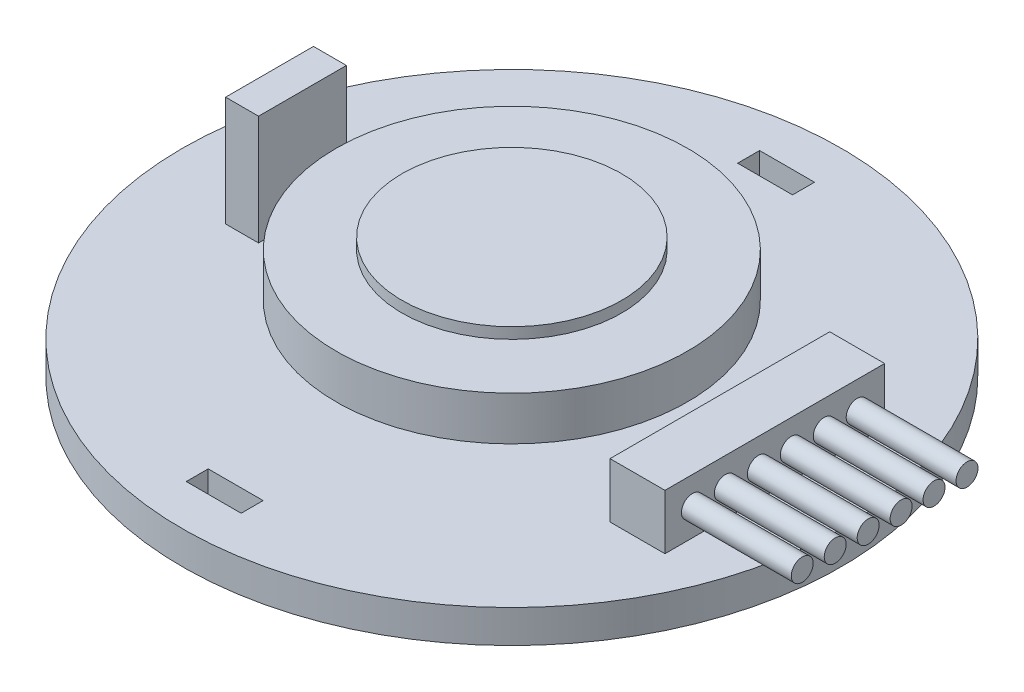
ISO-10303-21;
HEADER;
FILE_DESCRIPTION(('STEP AP214'),'2;1');
FILE_NAME('part.step','',(''),(''),'','','');
FILE_SCHEMA(('AUTOMOTIVE_DESIGN { 1 0 10303 214 1 1 1 1 }'));
ENDSEC;
DATA;
#1=APPLICATION_CONTEXT('core data for automotive mechanical design processes');
#2=APPLICATION_PROTOCOL_DEFINITION('international standard','automotive_design',2000,#1);
#3=PRODUCT_CONTEXT('',#1,'mechanical');
#4=PRODUCT('Part','Part','',(#3));
#5=PRODUCT_RELATED_PRODUCT_CATEGORY('part','',(#4));
#6=PRODUCT_DEFINITION_FORMATION('','',#4);
#7=PRODUCT_DEFINITION_CONTEXT('part definition',#1,'design');
#8=PRODUCT_DEFINITION('design','',#6,#7);
#9=PRODUCT_DEFINITION_SHAPE('','',#8);
#10=(LENGTH_UNIT() NAMED_UNIT(*) SI_UNIT(.MILLI.,.METRE.));
#11=(NAMED_UNIT(*) PLANE_ANGLE_UNIT() SI_UNIT($,.RADIAN.));
#12=(NAMED_UNIT(*) SI_UNIT($,.STERADIAN.) SOLID_ANGLE_UNIT());
#13=UNCERTAINTY_MEASURE_WITH_UNIT(LENGTH_MEASURE(1.E-05),#10,'distance_accuracy_value','');
#14=(GEOMETRIC_REPRESENTATION_CONTEXT(3) GLOBAL_UNCERTAINTY_ASSIGNED_CONTEXT((#13)) GLOBAL_UNIT_ASSIGNED_CONTEXT((#10,
#11,#12)) REPRESENTATION_CONTEXT('',''));
#15=CARTESIAN_POINT('',(0.,0.,0.));
#16=DIRECTION('',(0.,0.,1.));
#17=DIRECTION('',(1.,0.,0.));
#18=AXIS2_PLACEMENT_3D('',#15,#16,#17);
#19=CARTESIAN_POINT('',(15.0301297165824,1.07813382095376,0.));
#20=DIRECTION('',(0.,-1.,0.));
#21=DIRECTION('',(1.,0.,0.));
#22=AXIS2_PLACEMENT_3D('',#19,#20,#21);
#23=PLANE('',#22);
#24=CARTESIAN_POINT('',(0.0301297165823786,1.07813382095375,0.));
#25=DIRECTION('',(0.,1.,0.));
#26=DIRECTION('',(-1.,0.,0.));
#27=AXIS2_PLACEMENT_3D('',#24,#25,#26);
#28=CIRCLE('',#27,15.);
#29=CARTESIAN_POINT('',(-14.9698702834176,1.07813382095375,0.));
#30=VERTEX_POINT('',#29);
#31=EDGE_CURVE('E303',#30,#30,#28,.T.);
#32=ORIENTED_EDGE('',*,*,#31,.T.);
#33=EDGE_LOOP('',(#32));
#34=FACE_BOUND('',#33,.T.);
#35=CARTESIAN_POINT('',(0.0301297165823786,1.07813382095375,0.));
#36=DIRECTION('',(0.,1.,0.));
#37=DIRECTION('',(-1.,0.,0.));
#38=AXIS2_PLACEMENT_3D('',#35,#36,#37);
#39=CIRCLE('',#38,1.20000000000001);
#40=CARTESIAN_POINT('',(-1.16987028341763,1.07813382095375,0.));
#41=VERTEX_POINT('',#40);
#42=EDGE_CURVE('E300',#41,#41,#39,.T.);
#43=ORIENTED_EDGE('',*,*,#42,.F.);
#44=EDGE_LOOP('',(#43));
#45=FACE_BOUND('',#44,.T.);
#46=DIRECTION('',(1.,0.,0.));
#47=VECTOR('',#46,1.);
#48=CARTESIAN_POINT('',(-1.74201497399318,1.07813382095375,-12.05));
#49=LINE('',#48,#47);
#50=CARTESIAN_POINT('',(-1.74201497399318,1.07813382095376,-12.05));
#51=VERTEX_POINT('',#50);
#52=CARTESIAN_POINT('',(0.757985026006817,1.07813382095376,-12.05));
#53=VERTEX_POINT('',#52);
#54=EDGE_CURVE('E253',#51,#53,#49,.T.);
#55=ORIENTED_EDGE('',*,*,#54,.F.);
#56=DIRECTION('',(0.,0.,1.));
#57=VECTOR('',#56,1.);
#58=CARTESIAN_POINT('',(-1.74201497399318,1.07813382095375,-13.05));
#59=LINE('',#58,#57);
#60=CARTESIAN_POINT('',(-1.74201497399318,1.07813382095375,-13.05));
#61=VERTEX_POINT('',#60);
#62=EDGE_CURVE('E256',#61,#51,#59,.T.);
#63=ORIENTED_EDGE('',*,*,#62,.F.);
#64=DIRECTION('',(-1.,0.,0.));
#65=VECTOR('',#64,1.);
#66=CARTESIAN_POINT('',(-1.74201497399318,1.07813382095375,-13.05));
#67=LINE('',#66,#65);
#68=CARTESIAN_POINT('',(0.757985026006817,1.07813382095375,-13.05));
#69=VERTEX_POINT('',#68);
#70=EDGE_CURVE('E273',#69,#61,#67,.T.);
#71=ORIENTED_EDGE('',*,*,#70,.F.);
#72=DIRECTION('',(0.,0.,-1.));
#73=VECTOR('',#72,1.);
#74=CARTESIAN_POINT('',(0.757985026006817,1.07813382095375,-13.05));
#75=LINE('',#74,#73);
#76=EDGE_CURVE('E251',#53,#69,#75,.T.);
#77=ORIENTED_EDGE('',*,*,#76,.F.);
#78=EDGE_LOOP('',(#55,#63,#71,#77));
#79=FACE_BOUND('',#78,.T.);
#80=DIRECTION('',(1.,0.,0.));
#81=VECTOR('',#80,1.);
#82=CARTESIAN_POINT('',(-1.74201497399318,1.07813382095375,13.05));
#83=LINE('',#82,#81);
#84=CARTESIAN_POINT('',(-1.74201497399318,1.07813382095376,13.05));
#85=VERTEX_POINT('',#84);
#86=CARTESIAN_POINT('',(0.757985026006817,1.07813382095376,13.05));
#87=VERTEX_POINT('',#86);
#88=EDGE_CURVE('E222',#85,#87,#83,.T.);
#89=ORIENTED_EDGE('',*,*,#88,.F.);
#90=DIRECTION('',(0.,0.,1.));
#91=VECTOR('',#90,1.);
#92=CARTESIAN_POINT('',(-1.74201497399318,1.07813382095375,12.05));
#93=LINE('',#92,#91);
#94=CARTESIAN_POINT('',(-1.74201497399318,1.07813382095375,12.05));
#95=VERTEX_POINT('',#94);
#96=EDGE_CURVE('E225',#95,#85,#93,.T.);
#97=ORIENTED_EDGE('',*,*,#96,.F.);
#98=DIRECTION('',(-1.,0.,0.));
#99=VECTOR('',#98,1.);
#100=CARTESIAN_POINT('',(-1.74201497399318,1.07813382095375,12.05));
#101=LINE('',#100,#99);
#102=CARTESIAN_POINT('',(0.757985026006817,1.07813382095375,12.05));
#103=VERTEX_POINT('',#102);
#104=EDGE_CURVE('E242',#103,#95,#101,.T.);
#105=ORIENTED_EDGE('',*,*,#104,.F.);
#106=DIRECTION('',(0.,0.,-1.));
#107=VECTOR('',#106,1.);
#108=CARTESIAN_POINT('',(0.757985026006817,1.07813382095375,12.05));
#109=LINE('',#108,#107);
#110=EDGE_CURVE('E215',#87,#103,#109,.T.);
#111=ORIENTED_EDGE('',*,*,#110,.F.);
#112=EDGE_LOOP('',(#89,#97,#105,#111));
#113=FACE_BOUND('',#112,.T.);
#114=DIRECTION('',(1.,0.,0.));
#115=VECTOR('',#114,1.);
#116=CARTESIAN_POINT('',(-11.,1.07813382095375,2.));
#117=LINE('',#116,#115);
#118=CARTESIAN_POINT('',(-11.,1.07813382095375,2.));
#119=VERTEX_POINT('',#118);
#120=CARTESIAN_POINT('',(-9.5,1.07813382095375,2.));
#121=VERTEX_POINT('',#120);
#122=EDGE_CURVE('E201',#119,#121,#117,.T.);
#123=ORIENTED_EDGE('',*,*,#122,.F.);
#124=DIRECTION('',(0.,0.,-1.));
#125=VECTOR('',#124,1.);
#126=CARTESIAN_POINT('',(-11.,1.07813382095375,2.));
#127=LINE('',#126,#125);
#128=CARTESIAN_POINT('',(-11.,1.07813382095375,-2.));
#129=VERTEX_POINT('',#128);
#130=EDGE_CURVE('E188',#119,#129,#127,.T.);
#131=ORIENTED_EDGE('',*,*,#130,.T.);
#132=DIRECTION('',(1.,0.,0.));
#133=VECTOR('',#132,1.);
#134=CARTESIAN_POINT('',(-11.,1.07813382095375,-2.));
#135=LINE('',#134,#133);
#136=CARTESIAN_POINT('',(-9.5,1.07813382095375,-2.));
#137=VERTEX_POINT('',#136);
#138=EDGE_CURVE('E191',#129,#137,#135,.T.);
#139=ORIENTED_EDGE('',*,*,#138,.T.);
#140=DIRECTION('',(0.,0.,-1.));
#141=VECTOR('',#140,1.);
#142=CARTESIAN_POINT('',(-9.5,1.07813382095375,2.));
#143=LINE('',#142,#141);
#144=EDGE_CURVE('E71',#121,#137,#143,.T.);
#145=ORIENTED_EDGE('',*,*,#144,.F.);
#146=EDGE_LOOP('',(#123,#131,#139,#145));
#147=FACE_BOUND('',#146,.T.);
#148=DIRECTION('',(1.,0.,0.));
#149=VECTOR('',#148,1.);
#150=CARTESIAN_POINT('',(9.5,1.07813382095376,5.));
#151=LINE('',#150,#149);
#152=CARTESIAN_POINT('',(9.5,1.07813382095376,5.));
#153=VERTEX_POINT('',#152);
#154=CARTESIAN_POINT('',(12.,1.07813382095376,5.));
#155=VERTEX_POINT('',#154);
#156=EDGE_CURVE('E186',#153,#155,#151,.T.);
#157=ORIENTED_EDGE('',*,*,#156,.F.);
#158=DIRECTION('',(0.,0.,-1.));
#159=VECTOR('',#158,1.);
#160=CARTESIAN_POINT('',(9.5,1.07813382095376,5.));
#161=LINE('',#160,#159);
#162=CARTESIAN_POINT('',(9.5,1.07813382095376,-5.));
#163=VERTEX_POINT('',#162);
#164=EDGE_CURVE('E182',#153,#163,#161,.T.);
#165=ORIENTED_EDGE('',*,*,#164,.T.);
#166=DIRECTION('',(1.,0.,0.));
#167=VECTOR('',#166,1.);
#168=CARTESIAN_POINT('',(9.5,1.07813382095376,-5.));
#169=LINE('',#168,#167);
#170=CARTESIAN_POINT('',(12.,1.07813382095376,-5.));
#171=VERTEX_POINT('',#170);
#172=EDGE_CURVE('E63',#163,#171,#169,.T.);
#173=ORIENTED_EDGE('',*,*,#172,.T.);
#174=DIRECTION('',(0.,0.,-1.));
#175=VECTOR('',#174,1.);
#176=CARTESIAN_POINT('',(12.,1.07813382095376,5.));
#177=LINE('',#176,#175);
#178=EDGE_CURVE('E834',#155,#171,#177,.T.);
#179=ORIENTED_EDGE('',*,*,#178,.F.);
#180=EDGE_LOOP('',(#157,#165,#173,#179));
#181=FACE_BOUND('',#180,.T.);
#182=ADVANCED_FACE('F48',(#34,#45,#79,#113,#147,#181),#23,.F.);
#183=CARTESIAN_POINT('',(0.0301297165823793,-4.42186617904624,0.));
#184=DIRECTION('',(0.,1.,0.));
#185=DIRECTION('',(-1.,0.,0.));
#186=AXIS2_PLACEMENT_3D('',#183,#184,#185);
#187=PLANE('',#186);
#188=CARTESIAN_POINT('',(0.0301297165823793,-4.42186617904624,0.));
#189=DIRECTION('',(0.,1.,0.));
#190=DIRECTION('',(-1.,0.,0.));
#191=AXIS2_PLACEMENT_3D('',#188,#189,#190);
#192=CIRCLE('',#191,1.2);
#193=CARTESIAN_POINT('',(-1.16987028341762,-4.42186617904624,0.));
#194=VERTEX_POINT('',#193);
#195=EDGE_CURVE('E312',#194,#194,#192,.T.);
#196=ORIENTED_EDGE('',*,*,#195,.F.);
#197=EDGE_LOOP('',(#196));
#198=FACE_BOUND('',#197,.T.);
#199=ADVANCED_FACE('F50',(#198),#187,.F.);
#200=CARTESIAN_POINT('',(0.0301297165823781,5.07813382095375,0.));
#201=DIRECTION('',(0.,1.,0.));
#202=DIRECTION('',(-1.,0.,0.));
#203=AXIS2_PLACEMENT_3D('',#200,#201,#202);
#204=CYLINDRICAL_SURFACE('',#203,1.2);
#205=CARTESIAN_POINT('',(0.0301297165823788,-0.421866179046244,0.));
#206=DIRECTION('',(0.,1.,0.));
#207=DIRECTION('',(-1.,0.,0.));
#208=AXIS2_PLACEMENT_3D('',#205,#206,#207);
#209=CIRCLE('',#208,1.2);
#210=CARTESIAN_POINT('',(-1.16987028341762,-0.421866179046244,0.));
#211=VERTEX_POINT('',#210);
#212=EDGE_CURVE('E309',#211,#211,#209,.T.);
#213=ORIENTED_EDGE('',*,*,#212,.F.);
#214=EDGE_LOOP('',(#213));
#215=FACE_BOUND('',#214,.T.);
#216=ORIENTED_EDGE('',*,*,#195,.T.);
#217=EDGE_LOOP('',(#216));
#218=FACE_BOUND('',#217,.T.);
#219=ADVANCED_FACE('F365',(#215,#218),#204,.T.);
#220=CARTESIAN_POINT('',(1.23012971658238,-0.421866179046245,0.));
#221=DIRECTION('',(0.,1.,0.));
#222=DIRECTION('',(-1.,0.,0.));
#223=AXIS2_PLACEMENT_3D('',#220,#221,#222);
#224=PLANE('',#223);
#225=DIRECTION('',(1.,0.,0.));
#226=VECTOR('',#225,1.);
#227=CARTESIAN_POINT('',(-1.74201497399318,-0.421866179046245,12.05));
#228=LINE('',#227,#226);
#229=CARTESIAN_POINT('',(-1.74201497399318,-0.421866179046245,12.05));
#230=VERTEX_POINT('',#229);
#231=CARTESIAN_POINT('',(0.757985026006817,-0.421866179046245,12.05));
#232=VERTEX_POINT('',#231);
#233=EDGE_CURVE('E230',#230,#232,#228,.T.);
#234=ORIENTED_EDGE('',*,*,#233,.F.);
#235=DIRECTION('',(0.,0.,-1.));
#236=VECTOR('',#235,1.);
#237=CARTESIAN_POINT('',(-1.74201497399318,-0.421866179046245,12.05));
#238=LINE('',#237,#236);
#239=CARTESIAN_POINT('',(-1.74201497399318,-0.421866179046245,13.05));
#240=VERTEX_POINT('',#239);
#241=EDGE_CURVE('E228',#240,#230,#238,.T.);
#242=ORIENTED_EDGE('',*,*,#241,.F.);
#243=DIRECTION('',(-1.,0.,0.));
#244=VECTOR('',#243,1.);
#245=CARTESIAN_POINT('',(-1.74201497399318,-0.421866179046245,13.05));
#246=LINE('',#245,#244);
#247=CARTESIAN_POINT('',(0.757985026006817,-0.421866179046245,13.05));
#248=VERTEX_POINT('',#247);
#249=EDGE_CURVE('E236',#248,#240,#246,.T.);
#250=ORIENTED_EDGE('',*,*,#249,.F.);
#251=DIRECTION('',(0.,0.,1.));
#252=VECTOR('',#251,1.);
#253=CARTESIAN_POINT('',(0.757985026006817,-0.421866179046245,12.05));
#254=LINE('',#253,#252);
#255=EDGE_CURVE('E233',#232,#248,#254,.T.);
#256=ORIENTED_EDGE('',*,*,#255,.F.);
#257=EDGE_LOOP('',(#234,#242,#250,#256));
#258=FACE_BOUND('',#257,.T.);
#259=DIRECTION('',(1.,0.,0.));
#260=VECTOR('',#259,1.);
#261=CARTESIAN_POINT('',(-1.74201497399318,-0.421866179046245,-13.05));
#262=LINE('',#261,#260);
#263=CARTESIAN_POINT('',(-1.74201497399318,-0.421866179046245,-13.05));
#264=VERTEX_POINT('',#263);
#265=CARTESIAN_POINT('',(0.757985026006817,-0.421866179046245,-13.05));
#266=VERTEX_POINT('',#265);
#267=EDGE_CURVE('E261',#264,#266,#262,.T.);
#268=ORIENTED_EDGE('',*,*,#267,.F.);
#269=DIRECTION('',(0.,0.,-1.));
#270=VECTOR('',#269,1.);
#271=CARTESIAN_POINT('',(-1.74201497399318,-0.421866179046245,-13.05));
#272=LINE('',#271,#270);
#273=CARTESIAN_POINT('',(-1.74201497399318,-0.421866179046245,-12.05));
#274=VERTEX_POINT('',#273);
#275=EDGE_CURVE('E259',#274,#264,#272,.T.);
#276=ORIENTED_EDGE('',*,*,#275,.F.);
#277=DIRECTION('',(-1.,0.,0.));
#278=VECTOR('',#277,1.);
#279=CARTESIAN_POINT('',(-1.74201497399318,-0.421866179046245,-12.05));
#280=LINE('',#279,#278);
#281=CARTESIAN_POINT('',(0.757985026006817,-0.421866179046245,-12.05));
#282=VERTEX_POINT('',#281);
#283=EDGE_CURVE('E267',#282,#274,#280,.T.);
#284=ORIENTED_EDGE('',*,*,#283,.F.);
#285=DIRECTION('',(0.,0.,1.));
#286=VECTOR('',#285,1.);
#287=CARTESIAN_POINT('',(0.757985026006817,-0.421866179046245,-13.05));
#288=LINE('',#287,#286);
#289=EDGE_CURVE('E264',#266,#282,#288,.T.);
#290=ORIENTED_EDGE('',*,*,#289,.F.);
#291=EDGE_LOOP('',(#268,#276,#284,#290));
#292=FACE_BOUND('',#291,.T.);
#293=CARTESIAN_POINT('',(0.0301297165823788,-0.421866179046246,0.));
#294=DIRECTION('',(0.,1.,0.));
#295=DIRECTION('',(-1.,0.,0.));
#296=AXIS2_PLACEMENT_3D('',#293,#294,#295);
#297=CIRCLE('',#296,15.);
#298=CARTESIAN_POINT('',(-14.9698702834176,-0.421866179046247,0.));
#299=VERTEX_POINT('',#298);
#300=EDGE_CURVE('E306',#299,#299,#297,.T.);
#301=ORIENTED_EDGE('',*,*,#300,.F.);
#302=EDGE_LOOP('',(#301));
#303=FACE_BOUND('',#302,.T.);
#304=ORIENTED_EDGE('',*,*,#212,.T.);
#305=EDGE_LOOP('',(#304));
#306=FACE_BOUND('',#305,.T.);
#307=ADVANCED_FACE('F375',(#258,#292,#303,#306),#224,.F.);
#308=CARTESIAN_POINT('',(0.0301297165823781,5.07813382095375,0.));
#309=DIRECTION('',(0.,1.,0.));
#310=DIRECTION('',(-1.,0.,0.));
#311=AXIS2_PLACEMENT_3D('',#308,#309,#310);
#312=CYLINDRICAL_SURFACE('',#311,15.);
#313=ORIENTED_EDGE('',*,*,#31,.F.);
#314=EDGE_LOOP('',(#313));
#315=FACE_BOUND('',#314,.T.);
#316=ORIENTED_EDGE('',*,*,#300,.T.);
#317=EDGE_LOOP('',(#316));
#318=FACE_BOUND('',#317,.T.);
#319=ADVANCED_FACE('F372',(#315,#318),#312,.T.);
#320=CARTESIAN_POINT('',(0.0301297165823786,1.07813382095375,0.));
#321=DIRECTION('',(0.,-1.,0.));
#322=DIRECTION('',(1.,0.,0.));
#323=AXIS2_PLACEMENT_3D('',#320,#321,#322);
#324=CONICAL_SURFACE('',#323,1.20000000000001,0.197395559849881);
#325=CARTESIAN_POINT('',(0.0301297165823785,2.07813382095376,0.));
#326=DIRECTION('',(0.,1.,0.));
#327=DIRECTION('',(-1.,0.,0.));
#328=AXIS2_PLACEMENT_3D('',#325,#326,#327);
#329=CIRCLE('',#328,1.00000000000001);
#330=CARTESIAN_POINT('',(-0.969870283417629,2.07813382095376,0.));
#331=VERTEX_POINT('',#330);
#332=EDGE_CURVE('E297',#331,#331,#329,.T.);
#333=ORIENTED_EDGE('',*,*,#332,.F.);
#334=EDGE_LOOP('',(#333));
#335=FACE_BOUND('',#334,.T.);
#336=ORIENTED_EDGE('',*,*,#42,.T.);
#337=EDGE_LOOP('',(#336));
#338=FACE_BOUND('',#337,.T.);
#339=ADVANCED_FACE('F370',(#335,#338),#324,.T.);
#340=CARTESIAN_POINT('',(0.0301297165823781,5.07813382095375,0.));
#341=DIRECTION('',(0.,1.,0.));
#342=DIRECTION('',(-1.,0.,0.));
#343=AXIS2_PLACEMENT_3D('',#340,#341,#342);
#344=CYLINDRICAL_SURFACE('',#343,1.00000000000001);
#345=CARTESIAN_POINT('',(0.0301297165823784,2.57813382095376,0.));
#346=DIRECTION('',(0.,1.,0.));
#347=DIRECTION('',(-1.,0.,0.));
#348=AXIS2_PLACEMENT_3D('',#345,#346,#347);
#349=CIRCLE('',#348,1.00000000000001);
#350=CARTESIAN_POINT('',(-0.96987028341763,2.57813382095376,0.));
#351=VERTEX_POINT('',#350);
#352=EDGE_CURVE('E294',#351,#351,#349,.T.);
#353=ORIENTED_EDGE('',*,*,#352,.F.);
#354=EDGE_LOOP('',(#353));
#355=FACE_BOUND('',#354,.T.);
#356=ORIENTED_EDGE('',*,*,#332,.T.);
#357=EDGE_LOOP('',(#356));
#358=FACE_BOUND('',#357,.T.);
#359=ADVANCED_FACE('F406',(#355,#358),#344,.T.);
#360=CARTESIAN_POINT('',(1.03012971658239,2.57813382095376,0.));
#361=DIRECTION('',(0.,1.,0.));
#362=DIRECTION('',(-1.,0.,0.));
#363=AXIS2_PLACEMENT_3D('',#360,#361,#362);
#364=PLANE('',#363);
#365=CARTESIAN_POINT('',(0.0301297165823784,2.57813382095376,0.));
#366=DIRECTION('',(0.,1.,0.));
#367=DIRECTION('',(-1.,0.,0.));
#368=AXIS2_PLACEMENT_3D('',#365,#366,#367);
#369=CIRCLE('',#368,8.);
#370=CARTESIAN_POINT('',(-7.96987028341762,2.57813382095375,0.));
#371=VERTEX_POINT('',#370);
#372=EDGE_CURVE('E291',#371,#371,#369,.T.);
#373=ORIENTED_EDGE('',*,*,#372,.F.);
#374=EDGE_LOOP('',(#373));
#375=FACE_BOUND('',#374,.T.);
#376=ORIENTED_EDGE('',*,*,#352,.T.);
#377=EDGE_LOOP('',(#376));
#378=FACE_BOUND('',#377,.T.);
#379=ADVANCED_FACE('F413',(#375,#378),#364,.F.);
#380=CARTESIAN_POINT('',(0.0301297165823781,5.07813382095375,0.));
#381=DIRECTION('',(0.,1.,0.));
#382=DIRECTION('',(-1.,0.,0.));
#383=AXIS2_PLACEMENT_3D('',#380,#381,#382);
#384=CYLINDRICAL_SURFACE('',#383,8.);
#385=CARTESIAN_POINT('',(0.0301297165823782,4.57813382095375,0.));
#386=DIRECTION('',(0.,1.,0.));
#387=DIRECTION('',(-1.,0.,0.));
#388=AXIS2_PLACEMENT_3D('',#385,#386,#387);
#389=CIRCLE('',#388,8.);
#390=CARTESIAN_POINT('',(-7.96987028341762,4.57813382095375,0.));
#391=VERTEX_POINT('',#390);
#392=EDGE_CURVE('E288',#391,#391,#389,.T.);
#393=ORIENTED_EDGE('',*,*,#392,.F.);
#394=EDGE_LOOP('',(#393));
#395=FACE_BOUND('',#394,.T.);
#396=ORIENTED_EDGE('',*,*,#372,.T.);
#397=EDGE_LOOP('',(#396));
#398=FACE_BOUND('',#397,.T.);
#399=ADVANCED_FACE('F421',(#395,#398),#384,.T.);
#400=CARTESIAN_POINT('',(8.03012971658238,4.57813382095376,0.));
#401=DIRECTION('',(0.,-1.,0.));
#402=DIRECTION('',(1.,0.,0.));
#403=AXIS2_PLACEMENT_3D('',#400,#401,#402);
#404=PLANE('',#403);
#405=CARTESIAN_POINT('',(0.0301297165823782,4.57813382095375,0.));
#406=DIRECTION('',(0.,1.,0.));
#407=DIRECTION('',(-1.,0.,0.));
#408=AXIS2_PLACEMENT_3D('',#405,#406,#407);
#409=CIRCLE('',#408,5.);
#410=CARTESIAN_POINT('',(-4.96987028341762,4.57813382095375,0.));
#411=VERTEX_POINT('',#410);
#412=EDGE_CURVE('E285',#411,#411,#409,.T.);
#413=ORIENTED_EDGE('',*,*,#412,.F.);
#414=EDGE_LOOP('',(#413));
#415=FACE_BOUND('',#414,.T.);
#416=ORIENTED_EDGE('',*,*,#392,.T.);
#417=EDGE_LOOP('',(#416));
#418=FACE_BOUND('',#417,.T.);
#419=ADVANCED_FACE('F429',(#415,#418),#404,.F.);
#420=CARTESIAN_POINT('',(0.0301297165823781,5.07813382095375,0.));
#421=DIRECTION('',(0.,1.,0.));
#422=DIRECTION('',(-1.,0.,0.));
#423=AXIS2_PLACEMENT_3D('',#420,#421,#422);
#424=CYLINDRICAL_SURFACE('',#423,5.);
#425=CARTESIAN_POINT('',(0.0301297165823781,5.07813382095376,0.));
#426=DIRECTION('',(0.,1.,0.));
#427=DIRECTION('',(-1.,0.,0.));
#428=AXIS2_PLACEMENT_3D('',#425,#426,#427);
#429=CIRCLE('',#428,5.);
#430=CARTESIAN_POINT('',(-4.96987028341762,5.07813382095375,0.));
#431=VERTEX_POINT('',#430);
#432=EDGE_CURVE('E282',#431,#431,#429,.T.);
#433=ORIENTED_EDGE('',*,*,#432,.F.);
#434=EDGE_LOOP('',(#433));
#435=FACE_BOUND('',#434,.T.);
#436=ORIENTED_EDGE('',*,*,#412,.T.);
#437=EDGE_LOOP('',(#436));
#438=FACE_BOUND('',#437,.T.);
#439=ADVANCED_FACE('F436',(#435,#438),#424,.T.);
#440=CARTESIAN_POINT('',(5.03012971658238,5.07813382095375,0.));
#441=DIRECTION('',(0.,-1.,0.));
#442=DIRECTION('',(1.,0.,0.));
#443=AXIS2_PLACEMENT_3D('',#440,#441,#442);
#444=PLANE('',#443);
#445=ORIENTED_EDGE('',*,*,#432,.T.);
#446=EDGE_LOOP('',(#445));
#447=FACE_BOUND('',#446,.T.);
#448=ADVANCED_FACE('F443',(#447),#444,.F.);
#449=CARTESIAN_POINT('',(-1.74201497399318,5.07913382095376,-13.05));
#450=DIRECTION('',(-1.,0.,0.));
#451=DIRECTION('',(0.,-1.,0.));
#452=AXIS2_PLACEMENT_3D('',#449,#450,#451);
#453=PLANE('',#452);
#454=ORIENTED_EDGE('',*,*,#62,.T.);
#455=DIRECTION('',(0.,-1.,0.));
#456=VECTOR('',#455,1.);
#457=CARTESIAN_POINT('',(-1.74201497399318,5.07913382095376,-12.05));
#458=LINE('',#457,#456);
#459=EDGE_CURVE('E271',#51,#274,#458,.T.);
#460=ORIENTED_EDGE('',*,*,#459,.T.);
#461=ORIENTED_EDGE('',*,*,#275,.T.);
#462=DIRECTION('',(0.,-1.,0.));
#463=VECTOR('',#462,1.);
#464=CARTESIAN_POINT('',(-1.74201497399318,5.07913382095376,-13.05));
#465=LINE('',#464,#463);
#466=EDGE_CURVE('E270',#61,#264,#465,.T.);
#467=ORIENTED_EDGE('',*,*,#466,.F.);
#468=EDGE_LOOP('',(#454,#460,#461,#467));
#469=FACE_BOUND('',#468,.T.);
#470=ADVANCED_FACE('F451',(#469),#453,.F.);
#471=CARTESIAN_POINT('',(-1.74201497399318,5.07913382095376,-12.05));
#472=DIRECTION('',(0.,0.,1.));
#473=DIRECTION('',(1.,0.,0.));
#474=AXIS2_PLACEMENT_3D('',#471,#472,#473);
#475=PLANE('',#474);
#476=ORIENTED_EDGE('',*,*,#54,.T.);
#477=DIRECTION('',(0.,-1.,0.));
#478=VECTOR('',#477,1.);
#479=CARTESIAN_POINT('',(0.757985026006816,5.07913382095376,-12.05));
#480=LINE('',#479,#478);
#481=EDGE_CURVE('E274',#53,#282,#480,.T.);
#482=ORIENTED_EDGE('',*,*,#481,.T.);
#483=ORIENTED_EDGE('',*,*,#283,.T.);
#484=ORIENTED_EDGE('',*,*,#459,.F.);
#485=EDGE_LOOP('',(#476,#482,#483,#484));
#486=FACE_BOUND('',#485,.T.);
#487=ADVANCED_FACE('F457',(#486),#475,.F.);
#488=CARTESIAN_POINT('',(0.757985026006816,5.07913382095376,-13.05));
#489=DIRECTION('',(1.,0.,0.));
#490=DIRECTION('',(0.,1.,0.));
#491=AXIS2_PLACEMENT_3D('',#488,#489,#490);
#492=PLANE('',#491);
#493=ORIENTED_EDGE('',*,*,#76,.T.);
#494=DIRECTION('',(0.,-1.,0.));
#495=VECTOR('',#494,1.);
#496=CARTESIAN_POINT('',(0.757985026006816,5.07913382095376,-13.05));
#497=LINE('',#496,#495);
#498=EDGE_CURVE('E276',#69,#266,#497,.T.);
#499=ORIENTED_EDGE('',*,*,#498,.T.);
#500=ORIENTED_EDGE('',*,*,#289,.T.);
#501=ORIENTED_EDGE('',*,*,#481,.F.);
#502=EDGE_LOOP('',(#493,#499,#500,#501));
#503=FACE_BOUND('',#502,.T.);
#504=ADVANCED_FACE('F465',(#503),#492,.F.);
#505=CARTESIAN_POINT('',(-1.74201497399318,5.07913382095376,-13.05));
#506=DIRECTION('',(0.,0.,-1.));
#507=DIRECTION('',(-1.,0.,0.));
#508=AXIS2_PLACEMENT_3D('',#505,#506,#507);
#509=PLANE('',#508);
#510=ORIENTED_EDGE('',*,*,#70,.T.);
#511=ORIENTED_EDGE('',*,*,#466,.T.);
#512=ORIENTED_EDGE('',*,*,#267,.T.);
#513=ORIENTED_EDGE('',*,*,#498,.F.);
#514=EDGE_LOOP('',(#510,#511,#512,#513));
#515=FACE_BOUND('',#514,.T.);
#516=ADVANCED_FACE('F473',(#515),#509,.F.);
#517=CARTESIAN_POINT('',(-1.74201497399318,5.07913382095376,12.05));
#518=DIRECTION('',(-1.,0.,0.));
#519=DIRECTION('',(0.,-1.,0.));
#520=AXIS2_PLACEMENT_3D('',#517,#518,#519);
#521=PLANE('',#520);
#522=ORIENTED_EDGE('',*,*,#96,.T.);
#523=DIRECTION('',(0.,-1.,0.));
#524=VECTOR('',#523,1.);
#525=CARTESIAN_POINT('',(-1.74201497399318,5.07913382095376,13.05));
#526=LINE('',#525,#524);
#527=EDGE_CURVE('E240',#85,#240,#526,.T.);
#528=ORIENTED_EDGE('',*,*,#527,.T.);
#529=ORIENTED_EDGE('',*,*,#241,.T.);
#530=DIRECTION('',(0.,-1.,0.));
#531=VECTOR('',#530,1.);
#532=CARTESIAN_POINT('',(-1.74201497399318,5.07913382095376,12.05));
#533=LINE('',#532,#531);
#534=EDGE_CURVE('E239',#95,#230,#533,.T.);
#535=ORIENTED_EDGE('',*,*,#534,.F.);
#536=EDGE_LOOP('',(#522,#528,#529,#535));
#537=FACE_BOUND('',#536,.T.);
#538=ADVANCED_FACE('F481',(#537),#521,.F.);
#539=CARTESIAN_POINT('',(-1.74201497399318,5.07913382095376,13.05));
#540=DIRECTION('',(0.,0.,1.));
#541=DIRECTION('',(1.,0.,0.));
#542=AXIS2_PLACEMENT_3D('',#539,#540,#541);
#543=PLANE('',#542);
#544=ORIENTED_EDGE('',*,*,#88,.T.);
#545=DIRECTION('',(0.,-1.,0.));
#546=VECTOR('',#545,1.);
#547=CARTESIAN_POINT('',(0.757985026006816,5.07913382095376,13.05));
#548=LINE('',#547,#546);
#549=EDGE_CURVE('E243',#87,#248,#548,.T.);
#550=ORIENTED_EDGE('',*,*,#549,.T.);
#551=ORIENTED_EDGE('',*,*,#249,.T.);
#552=ORIENTED_EDGE('',*,*,#527,.F.);
#553=EDGE_LOOP('',(#544,#550,#551,#552));
#554=FACE_BOUND('',#553,.T.);
#555=ADVANCED_FACE('F489',(#554),#543,.F.);
#556=CARTESIAN_POINT('',(0.757985026006816,5.07913382095376,12.05));
#557=DIRECTION('',(1.,0.,0.));
#558=DIRECTION('',(0.,1.,0.));
#559=AXIS2_PLACEMENT_3D('',#556,#557,#558);
#560=PLANE('',#559);
#561=ORIENTED_EDGE('',*,*,#110,.T.);
#562=DIRECTION('',(0.,-1.,0.));
#563=VECTOR('',#562,1.);
#564=CARTESIAN_POINT('',(0.757985026006816,5.07913382095376,12.05));
#565=LINE('',#564,#563);
#566=EDGE_CURVE('E245',#103,#232,#565,.T.);
#567=ORIENTED_EDGE('',*,*,#566,.T.);
#568=ORIENTED_EDGE('',*,*,#255,.T.);
#569=ORIENTED_EDGE('',*,*,#549,.F.);
#570=EDGE_LOOP('',(#561,#567,#568,#569));
#571=FACE_BOUND('',#570,.T.);
#572=ADVANCED_FACE('F497',(#571),#560,.F.);
#573=CARTESIAN_POINT('',(-1.74201497399318,5.07913382095376,12.05));
#574=DIRECTION('',(0.,0.,-1.));
#575=DIRECTION('',(-1.,0.,0.));
#576=AXIS2_PLACEMENT_3D('',#573,#574,#575);
#577=PLANE('',#576);
#578=ORIENTED_EDGE('',*,*,#104,.T.);
#579=ORIENTED_EDGE('',*,*,#534,.T.);
#580=ORIENTED_EDGE('',*,*,#233,.T.);
#581=ORIENTED_EDGE('',*,*,#566,.F.);
#582=EDGE_LOOP('',(#578,#579,#580,#581));
#583=FACE_BOUND('',#582,.T.);
#584=ADVANCED_FACE('F505',(#583),#577,.F.);
#585=CARTESIAN_POINT('',(-11.,6.07813382095375,2.));
#586=DIRECTION('',(-1.,0.,0.));
#587=DIRECTION('',(0.,-1.,0.));
#588=AXIS2_PLACEMENT_3D('',#585,#586,#587);
#589=PLANE('',#588);
#590=ORIENTED_EDGE('',*,*,#130,.F.);
#591=DIRECTION('',(0.,-1.,0.));
#592=VECTOR('',#591,1.);
#593=CARTESIAN_POINT('',(-11.,6.07813382095375,2.));
#594=LINE('',#593,#592);
#595=CARTESIAN_POINT('',(-11.,6.07813382095375,2.));
#596=VERTEX_POINT('',#595);
#597=EDGE_CURVE('E213',#596,#119,#594,.T.);
#598=ORIENTED_EDGE('',*,*,#597,.F.);
#599=DIRECTION('',(0.,0.,-1.));
#600=VECTOR('',#599,1.);
#601=CARTESIAN_POINT('',(-11.,6.07813382095375,2.));
#602=LINE('',#601,#600);
#603=CARTESIAN_POINT('',(-11.,6.07813382095375,-2.));
#604=VERTEX_POINT('',#603);
#605=EDGE_CURVE('E197',#596,#604,#602,.T.);
#606=ORIENTED_EDGE('',*,*,#605,.T.);
#607=DIRECTION('',(0.,-1.,0.));
#608=VECTOR('',#607,1.);
#609=CARTESIAN_POINT('',(-11.,6.07813382095375,-2.));
#610=LINE('',#609,#608);
#611=EDGE_CURVE('E207',#604,#129,#610,.T.);
#612=ORIENTED_EDGE('',*,*,#611,.T.);
#613=EDGE_LOOP('',(#590,#598,#606,#612));
#614=FACE_BOUND('',#613,.T.);
#615=ADVANCED_FACE('F513',(#614),#589,.T.);
#616=CARTESIAN_POINT('',(-11.,6.07813382095375,2.));
#617=DIRECTION('',(0.,0.,-1.));
#618=DIRECTION('',(-1.,0.,0.));
#619=AXIS2_PLACEMENT_3D('',#616,#617,#618);
#620=PLANE('',#619);
#621=ORIENTED_EDGE('',*,*,#122,.T.);
#622=DIRECTION('',(0.,-1.,0.));
#623=VECTOR('',#622,1.);
#624=CARTESIAN_POINT('',(-9.5,6.07813382095375,2.));
#625=LINE('',#624,#623);
#626=CARTESIAN_POINT('',(-9.5,6.07813382095375,2.));
#627=VERTEX_POINT('',#626);
#628=EDGE_CURVE('E216',#627,#121,#625,.T.);
#629=ORIENTED_EDGE('',*,*,#628,.F.);
#630=DIRECTION('',(1.,0.,0.));
#631=VECTOR('',#630,1.);
#632=CARTESIAN_POINT('',(-11.,6.07813382095375,2.));
#633=LINE('',#632,#631);
#634=EDGE_CURVE('E206',#596,#627,#633,.T.);
#635=ORIENTED_EDGE('',*,*,#634,.F.);
#636=ORIENTED_EDGE('',*,*,#597,.T.);
#637=EDGE_LOOP('',(#621,#629,#635,#636));
#638=FACE_BOUND('',#637,.T.);
#639=ADVANCED_FACE('F521',(#638),#620,.F.);
#640=CARTESIAN_POINT('',(-9.5,6.07813382095375,2.));
#641=DIRECTION('',(-1.,0.,0.));
#642=DIRECTION('',(0.,-1.,0.));
#643=AXIS2_PLACEMENT_3D('',#640,#641,#642);
#644=PLANE('',#643);
#645=ORIENTED_EDGE('',*,*,#144,.T.);
#646=DIRECTION('',(0.,-1.,0.));
#647=VECTOR('',#646,1.);
#648=CARTESIAN_POINT('',(-9.5,6.07813382095375,-2.));
#649=LINE('',#648,#647);
#650=CARTESIAN_POINT('',(-9.5,6.07813382095375,-2.));
#651=VERTEX_POINT('',#650);
#652=EDGE_CURVE('E218',#651,#137,#649,.T.);
#653=ORIENTED_EDGE('',*,*,#652,.F.);
#654=DIRECTION('',(0.,0.,-1.));
#655=VECTOR('',#654,1.);
#656=CARTESIAN_POINT('',(-9.5,6.07813382095375,2.));
#657=LINE('',#656,#655);
#658=EDGE_CURVE('E204',#627,#651,#657,.T.);
#659=ORIENTED_EDGE('',*,*,#658,.F.);
#660=ORIENTED_EDGE('',*,*,#628,.T.);
#661=EDGE_LOOP('',(#645,#653,#659,#660));
#662=FACE_BOUND('',#661,.T.);
#663=ADVANCED_FACE('F529',(#662),#644,.F.);
#664=CARTESIAN_POINT('',(-11.,6.07813382095375,-2.));
#665=DIRECTION('',(0.,0.,-1.));
#666=DIRECTION('',(-1.,0.,0.));
#667=AXIS2_PLACEMENT_3D('',#664,#665,#666);
#668=PLANE('',#667);
#669=ORIENTED_EDGE('',*,*,#138,.F.);
#670=ORIENTED_EDGE('',*,*,#611,.F.);
#671=DIRECTION('',(1.,0.,0.));
#672=VECTOR('',#671,1.);
#673=CARTESIAN_POINT('',(-11.,6.07813382095375,-2.));
#674=LINE('',#673,#672);
#675=EDGE_CURVE('E200',#604,#651,#674,.T.);
#676=ORIENTED_EDGE('',*,*,#675,.T.);
#677=ORIENTED_EDGE('',*,*,#652,.T.);
#678=EDGE_LOOP('',(#669,#670,#676,#677));
#679=FACE_BOUND('',#678,.T.);
#680=ADVANCED_FACE('F537',(#679),#668,.T.);
#681=CARTESIAN_POINT('',(0.,6.07813382095375,0.));
#682=DIRECTION('',(0.,-1.,0.));
#683=DIRECTION('',(1.,0.,0.));
#684=AXIS2_PLACEMENT_3D('',#681,#682,#683);
#685=PLANE('',#684);
#686=ORIENTED_EDGE('',*,*,#605,.F.);
#687=ORIENTED_EDGE('',*,*,#634,.T.);
#688=ORIENTED_EDGE('',*,*,#658,.T.);
#689=ORIENTED_EDGE('',*,*,#675,.F.);
#690=EDGE_LOOP('',(#686,#687,#688,#689));
#691=FACE_BOUND('',#690,.T.);
#692=ADVANCED_FACE('F544',(#691),#685,.F.);
#693=CARTESIAN_POINT('',(9.5,3.57813382095376,5.));
#694=DIRECTION('',(0.,0.,-1.));
#695=DIRECTION('',(-1.,0.,0.));
#696=AXIS2_PLACEMENT_3D('',#693,#694,#695);
#697=PLANE('',#696);
#698=ORIENTED_EDGE('',*,*,#156,.T.);
#699=DIRECTION('',(0.,-1.,0.));
#700=VECTOR('',#699,1.);
#701=CARTESIAN_POINT('',(12.,3.57813382095376,5.));
#702=LINE('',#701,#700);
#703=CARTESIAN_POINT('',(12.,3.57813382095376,5.));
#704=VERTEX_POINT('',#703);
#705=EDGE_CURVE('E167',#704,#155,#702,.T.);
#706=ORIENTED_EDGE('',*,*,#705,.F.);
#707=DIRECTION('',(1.,0.,0.));
#708=VECTOR('',#707,1.);
#709=CARTESIAN_POINT('',(9.5,3.57813382095376,5.));
#710=LINE('',#709,#708);
#711=CARTESIAN_POINT('',(9.5,3.57813382095376,5.));
#712=VERTEX_POINT('',#711);
#713=EDGE_CURVE('E174',#712,#704,#710,.T.);
#714=ORIENTED_EDGE('',*,*,#713,.F.);
#715=DIRECTION('',(0.,-1.,0.));
#716=VECTOR('',#715,1.);
#717=CARTESIAN_POINT('',(9.5,3.57813382095376,5.));
#718=LINE('',#717,#716);
#719=EDGE_CURVE('E832',#712,#153,#718,.T.);
#720=ORIENTED_EDGE('',*,*,#719,.T.);
#721=EDGE_LOOP('',(#698,#706,#714,#720));
#722=FACE_BOUND('',#721,.T.);
#723=ADVANCED_FACE('F184',(#722),#697,.F.);
#724=CARTESIAN_POINT('',(12.,3.57813382095376,5.));
#725=DIRECTION('',(-1.,0.,0.));
#726=DIRECTION('',(0.,-1.,0.));
#727=AXIS2_PLACEMENT_3D('',#724,#725,#726);
#728=PLANE('',#727);
#729=CARTESIAN_POINT('',(12.,2.32813382095376,-3.75));
#730=DIRECTION('',(-1.,0.,0.));
#731=DIRECTION('',(0.,-1.,0.));
#732=AXIS2_PLACEMENT_3D('',#729,#730,#731);
#733=CIRCLE('',#732,0.5);
#734=CARTESIAN_POINT('',(12.,1.82813382095376,-3.75));
#735=VERTEX_POINT('',#734);
#736=EDGE_CURVE('E13',#735,#735,#733,.F.);
#737=ORIENTED_EDGE('',*,*,#736,.F.);
#738=EDGE_LOOP('',(#737));
#739=FACE_BOUND('',#738,.T.);
#740=CARTESIAN_POINT('',(12.,2.32813382095376,-2.25));
#741=DIRECTION('',(-1.,0.,0.));
#742=DIRECTION('',(0.,-1.,0.));
#743=AXIS2_PLACEMENT_3D('',#740,#741,#742);
#744=CIRCLE('',#743,0.5);
#745=CARTESIAN_POINT('',(12.,1.82813382095376,-2.25));
#746=VERTEX_POINT('',#745);
#747=EDGE_CURVE('E56',#746,#746,#744,.F.);
#748=ORIENTED_EDGE('',*,*,#747,.F.);
#749=EDGE_LOOP('',(#748));
#750=FACE_BOUND('',#749,.T.);
#751=CARTESIAN_POINT('',(12.,2.32813382095376,-0.750000000000001));
#752=DIRECTION('',(-1.,0.,0.));
#753=DIRECTION('',(0.,-1.,0.));
#754=AXIS2_PLACEMENT_3D('',#751,#752,#753);
#755=CIRCLE('',#754,0.5);
#756=CARTESIAN_POINT('',(12.,1.82813382095376,-0.750000000000001));
#757=VERTEX_POINT('',#756);
#758=EDGE_CURVE('E324',#757,#757,#755,.F.);
#759=ORIENTED_EDGE('',*,*,#758,.F.);
#760=EDGE_LOOP('',(#759));
#761=FACE_BOUND('',#760,.T.);
#762=CARTESIAN_POINT('',(12.,2.32813382095376,0.75));
#763=DIRECTION('',(-1.,0.,0.));
#764=DIRECTION('',(0.,-1.,0.));
#765=AXIS2_PLACEMENT_3D('',#762,#763,#764);
#766=CIRCLE('',#765,0.5);
#767=CARTESIAN_POINT('',(12.,1.82813382095376,0.75));
#768=VERTEX_POINT('',#767);
#769=EDGE_CURVE('E321',#768,#768,#766,.F.);
#770=ORIENTED_EDGE('',*,*,#769,.F.);
#771=EDGE_LOOP('',(#770));
#772=FACE_BOUND('',#771,.T.);
#773=CARTESIAN_POINT('',(12.,2.32813382095376,2.25));
#774=DIRECTION('',(-1.,0.,0.));
#775=DIRECTION('',(0.,-1.,0.));
#776=AXIS2_PLACEMENT_3D('',#773,#774,#775);
#777=CIRCLE('',#776,0.5);
#778=CARTESIAN_POINT('',(12.,1.82813382095376,2.25));
#779=VERTEX_POINT('',#778);
#780=EDGE_CURVE('E318',#779,#779,#777,.F.);
#781=ORIENTED_EDGE('',*,*,#780,.F.);
#782=EDGE_LOOP('',(#781));
#783=FACE_BOUND('',#782,.T.);
#784=CARTESIAN_POINT('',(12.,2.32813382095376,3.75));
#785=DIRECTION('',(-1.,0.,0.));
#786=DIRECTION('',(0.,-1.,0.));
#787=AXIS2_PLACEMENT_3D('',#784,#785,#786);
#788=CIRCLE('',#787,0.5);
#789=CARTESIAN_POINT('',(12.,1.82813382095376,3.75));
#790=VERTEX_POINT('',#789);
#791=EDGE_CURVE('E315',#790,#790,#788,.F.);
#792=ORIENTED_EDGE('',*,*,#791,.F.);
#793=EDGE_LOOP('',(#792));
#794=FACE_BOUND('',#793,.T.);
#795=ORIENTED_EDGE('',*,*,#178,.T.);
#796=DIRECTION('',(0.,-1.,0.));
#797=VECTOR('',#796,1.);
#798=CARTESIAN_POINT('',(12.,3.57813382095376,-5.));
#799=LINE('',#798,#797);
#800=CARTESIAN_POINT('',(12.,3.57813382095376,-5.));
#801=VERTEX_POINT('',#800);
#802=EDGE_CURVE('E169',#801,#171,#799,.T.);
#803=ORIENTED_EDGE('',*,*,#802,.F.);
#804=DIRECTION('',(0.,0.,-1.));
#805=VECTOR('',#804,1.);
#806=CARTESIAN_POINT('',(12.,3.57813382095376,5.));
#807=LINE('',#806,#805);
#808=EDGE_CURVE('E162',#704,#801,#807,.T.);
#809=ORIENTED_EDGE('',*,*,#808,.F.);
#810=ORIENTED_EDGE('',*,*,#705,.T.);
#811=EDGE_LOOP('',(#795,#803,#809,#810));
#812=FACE_BOUND('',#811,.T.);
#813=ADVANCED_FACE('F165',(#739,#750,#761,#772,#783,#794,#812),#728,.F.);
#814=CARTESIAN_POINT('',(9.5,3.57813382095376,-5.));
#815=DIRECTION('',(0.,0.,-1.));
#816=DIRECTION('',(-1.,0.,0.));
#817=AXIS2_PLACEMENT_3D('',#814,#815,#816);
#818=PLANE('',#817);
#819=ORIENTED_EDGE('',*,*,#172,.F.);
#820=DIRECTION('',(0.,-1.,0.));
#821=VECTOR('',#820,1.);
#822=CARTESIAN_POINT('',(9.5,3.57813382095376,-5.));
#823=LINE('',#822,#821);
#824=CARTESIAN_POINT('',(9.5,3.57813382095376,-5.));
#825=VERTEX_POINT('',#824);
#826=EDGE_CURVE('E193',#825,#163,#823,.T.);
#827=ORIENTED_EDGE('',*,*,#826,.F.);
#828=DIRECTION('',(1.,0.,0.));
#829=VECTOR('',#828,1.);
#830=CARTESIAN_POINT('',(9.5,3.57813382095376,-5.));
#831=LINE('',#830,#829);
#832=EDGE_CURVE('E173',#825,#801,#831,.T.);
#833=ORIENTED_EDGE('',*,*,#832,.T.);
#834=ORIENTED_EDGE('',*,*,#802,.T.);
#835=EDGE_LOOP('',(#819,#827,#833,#834));
#836=FACE_BOUND('',#835,.T.);
#837=ADVANCED_FACE('F333',(#836),#818,.T.);
#838=CARTESIAN_POINT('',(9.5,3.57813382095376,5.));
#839=DIRECTION('',(-1.,0.,0.));
#840=DIRECTION('',(0.,-1.,0.));
#841=AXIS2_PLACEMENT_3D('',#838,#839,#840);
#842=PLANE('',#841);
#843=ORIENTED_EDGE('',*,*,#164,.F.);
#844=ORIENTED_EDGE('',*,*,#719,.F.);
#845=DIRECTION('',(0.,0.,-1.));
#846=VECTOR('',#845,1.);
#847=CARTESIAN_POINT('',(9.5,3.57813382095376,5.));
#848=LINE('',#847,#846);
#849=EDGE_CURVE('E180',#712,#825,#848,.T.);
#850=ORIENTED_EDGE('',*,*,#849,.T.);
#851=ORIENTED_EDGE('',*,*,#826,.T.);
#852=EDGE_LOOP('',(#843,#844,#850,#851));
#853=FACE_BOUND('',#852,.T.);
#854=ADVANCED_FACE('F356',(#853),#842,.T.);
#855=CARTESIAN_POINT('',(0.,3.57813382095375,0.));
#856=DIRECTION('',(0.,1.,0.));
#857=DIRECTION('',(-1.,0.,0.));
#858=AXIS2_PLACEMENT_3D('',#855,#856,#857);
#859=PLANE('',#858);
#860=ORIENTED_EDGE('',*,*,#713,.T.);
#861=ORIENTED_EDGE('',*,*,#808,.T.);
#862=ORIENTED_EDGE('',*,*,#832,.F.);
#863=ORIENTED_EDGE('',*,*,#849,.F.);
#864=EDGE_LOOP('',(#860,#861,#862,#863));
#865=FACE_BOUND('',#864,.T.);
#866=ADVANCED_FACE('F178',(#865),#859,.T.);
#867=CARTESIAN_POINT('',(17.,2.32813382095376,3.75));
#868=DIRECTION('',(-1.,0.,0.));
#869=DIRECTION('',(0.,-1.,0.));
#870=AXIS2_PLACEMENT_3D('',#867,#868,#869);
#871=CYLINDRICAL_SURFACE('',#870,0.5);
#872=CARTESIAN_POINT('',(17.,2.32813382095376,3.75));
#873=DIRECTION('',(1.,0.,0.));
#874=DIRECTION('',(0.,1.,0.));
#875=AXIS2_PLACEMENT_3D('',#872,#873,#874);
#876=CIRCLE('',#875,0.5);
#877=CARTESIAN_POINT('',(17.,2.82813382095376,3.75));
#878=VERTEX_POINT('',#877);
#879=EDGE_CURVE('E827',#878,#878,#876,.T.);
#880=ORIENTED_EDGE('',*,*,#879,.F.);
#881=EDGE_LOOP('',(#880));
#882=FACE_BOUND('',#881,.T.);
#883=ORIENTED_EDGE('',*,*,#791,.T.);
#884=EDGE_LOOP('',(#883));
#885=FACE_BOUND('',#884,.T.);
#886=ADVANCED_FACE('F344',(#882,#885),#871,.T.);
#887=CARTESIAN_POINT('',(17.,2.32813382095376,3.75));
#888=DIRECTION('',(1.,0.,0.));
#889=DIRECTION('',(0.,1.,0.));
#890=AXIS2_PLACEMENT_3D('',#887,#888,#889);
#891=PLANE('',#890);
#892=ORIENTED_EDGE('',*,*,#879,.T.);
#893=EDGE_LOOP('',(#892));
#894=FACE_BOUND('',#893,.T.);
#895=ADVANCED_FACE('F346',(#894),#891,.T.);
#896=CARTESIAN_POINT('',(17.,2.32813382095376,2.25));
#897=DIRECTION('',(-1.,0.,0.));
#898=DIRECTION('',(0.,-1.,0.));
#899=AXIS2_PLACEMENT_3D('',#896,#897,#898);
#900=CYLINDRICAL_SURFACE('',#899,0.5);
#901=CARTESIAN_POINT('',(17.,2.32813382095376,2.25));
#902=DIRECTION('',(1.,0.,0.));
#903=DIRECTION('',(0.,1.,0.));
#904=AXIS2_PLACEMENT_3D('',#901,#902,#903);
#905=CIRCLE('',#904,0.5);
#906=CARTESIAN_POINT('',(17.,2.82813382095376,2.25));
#907=VERTEX_POINT('',#906);
#908=EDGE_CURVE('E824',#907,#907,#905,.T.);
#909=ORIENTED_EDGE('',*,*,#908,.F.);
#910=EDGE_LOOP('',(#909));
#911=FACE_BOUND('',#910,.T.);
#912=ORIENTED_EDGE('',*,*,#780,.T.);
#913=EDGE_LOOP('',(#912));
#914=FACE_BOUND('',#913,.T.);
#915=ADVANCED_FACE('F353',(#911,#914),#900,.T.);
#916=CARTESIAN_POINT('',(17.,2.32813382095376,2.25));
#917=DIRECTION('',(1.,0.,0.));
#918=DIRECTION('',(0.,1.,0.));
#919=AXIS2_PLACEMENT_3D('',#916,#917,#918);
#920=PLANE('',#919);
#921=ORIENTED_EDGE('',*,*,#908,.T.);
#922=EDGE_LOOP('',(#921));
#923=FACE_BOUND('',#922,.T.);
#924=ADVANCED_FACE('F615',(#923),#920,.T.);
#925=CARTESIAN_POINT('',(17.,2.32813382095376,0.75));
#926=DIRECTION('',(-1.,0.,0.));
#927=DIRECTION('',(0.,-1.,0.));
#928=AXIS2_PLACEMENT_3D('',#925,#926,#927);
#929=CYLINDRICAL_SURFACE('',#928,0.5);
#930=CARTESIAN_POINT('',(17.,2.32813382095376,0.75));
#931=DIRECTION('',(1.,0.,0.));
#932=DIRECTION('',(0.,1.,0.));
#933=AXIS2_PLACEMENT_3D('',#930,#931,#932);
#934=CIRCLE('',#933,0.5);
#935=CARTESIAN_POINT('',(17.,2.82813382095376,0.75));
#936=VERTEX_POINT('',#935);
#937=EDGE_CURVE('E821',#936,#936,#934,.T.);
#938=ORIENTED_EDGE('',*,*,#937,.F.);
#939=EDGE_LOOP('',(#938));
#940=FACE_BOUND('',#939,.T.);
#941=ORIENTED_EDGE('',*,*,#769,.T.);
#942=EDGE_LOOP('',(#941));
#943=FACE_BOUND('',#942,.T.);
#944=ADVANCED_FACE('F626',(#940,#943),#929,.T.);
#945=CARTESIAN_POINT('',(17.,2.32813382095376,0.75));
#946=DIRECTION('',(1.,0.,0.));
#947=DIRECTION('',(0.,1.,0.));
#948=AXIS2_PLACEMENT_3D('',#945,#946,#947);
#949=PLANE('',#948);
#950=ORIENTED_EDGE('',*,*,#937,.T.);
#951=EDGE_LOOP('',(#950));
#952=FACE_BOUND('',#951,.T.);
#953=ADVANCED_FACE('F637',(#952),#949,.T.);
#954=CARTESIAN_POINT('',(17.,2.32813382095376,-0.750000000000001));
#955=DIRECTION('',(-1.,0.,0.));
#956=DIRECTION('',(0.,-1.,0.));
#957=AXIS2_PLACEMENT_3D('',#954,#955,#956);
#958=CYLINDRICAL_SURFACE('',#957,0.5);
#959=CARTESIAN_POINT('',(17.,2.32813382095376,-0.750000000000001));
#960=DIRECTION('',(1.,0.,0.));
#961=DIRECTION('',(0.,1.,0.));
#962=AXIS2_PLACEMENT_3D('',#959,#960,#961);
#963=CIRCLE('',#962,0.5);
#964=CARTESIAN_POINT('',(17.,2.82813382095376,-0.750000000000001));
#965=VERTEX_POINT('',#964);
#966=EDGE_CURVE('E816',#965,#965,#963,.T.);
#967=ORIENTED_EDGE('',*,*,#966,.F.);
#968=EDGE_LOOP('',(#967));
#969=FACE_BOUND('',#968,.T.);
#970=ORIENTED_EDGE('',*,*,#758,.T.);
#971=EDGE_LOOP('',(#970));
#972=FACE_BOUND('',#971,.T.);
#973=ADVANCED_FACE('F648',(#969,#972),#958,.T.);
#974=CARTESIAN_POINT('',(17.,2.32813382095376,-0.750000000000001));
#975=DIRECTION('',(1.,0.,0.));
#976=DIRECTION('',(0.,1.,0.));
#977=AXIS2_PLACEMENT_3D('',#974,#975,#976);
#978=PLANE('',#977);
#979=ORIENTED_EDGE('',*,*,#966,.T.);
#980=EDGE_LOOP('',(#979));
#981=FACE_BOUND('',#980,.T.);
#982=ADVANCED_FACE('F659',(#981),#978,.T.);
#983=CARTESIAN_POINT('',(17.,2.32813382095376,-2.25));
#984=DIRECTION('',(-1.,0.,0.));
#985=DIRECTION('',(0.,-1.,0.));
#986=AXIS2_PLACEMENT_3D('',#983,#984,#985);
#987=CYLINDRICAL_SURFACE('',#986,0.5);
#988=CARTESIAN_POINT('',(17.,2.32813382095376,-2.25));
#989=DIRECTION('',(1.,0.,0.));
#990=DIRECTION('',(0.,1.,0.));
#991=AXIS2_PLACEMENT_3D('',#988,#989,#990);
#992=CIRCLE('',#991,0.5);
#993=CARTESIAN_POINT('',(17.,2.82813382095376,-2.25));
#994=VERTEX_POINT('',#993);
#995=EDGE_CURVE('E813',#994,#994,#992,.T.);
#996=ORIENTED_EDGE('',*,*,#995,.F.);
#997=EDGE_LOOP('',(#996));
#998=FACE_BOUND('',#997,.T.);
#999=ORIENTED_EDGE('',*,*,#747,.T.);
#1000=EDGE_LOOP('',(#999));
#1001=FACE_BOUND('',#1000,.T.);
#1002=ADVANCED_FACE('F329',(#998,#1001),#987,.T.);
#1003=CARTESIAN_POINT('',(17.,2.32813382095376,-2.25));
#1004=DIRECTION('',(1.,0.,0.));
#1005=DIRECTION('',(0.,1.,0.));
#1006=AXIS2_PLACEMENT_3D('',#1003,#1004,#1005);
#1007=PLANE('',#1006);
#1008=ORIENTED_EDGE('',*,*,#995,.T.);
#1009=EDGE_LOOP('',(#1008));
#1010=FACE_BOUND('',#1009,.T.);
#1011=ADVANCED_FACE('F680',(#1010),#1007,.T.);
#1012=CARTESIAN_POINT('',(17.,2.32813382095376,-3.75));
#1013=DIRECTION('',(-1.,0.,0.));
#1014=DIRECTION('',(0.,-1.,0.));
#1015=AXIS2_PLACEMENT_3D('',#1012,#1013,#1014);
#1016=CYLINDRICAL_SURFACE('',#1015,0.5);
#1017=CARTESIAN_POINT('',(17.,2.32813382095376,-3.75));
#1018=DIRECTION('',(1.,0.,0.));
#1019=DIRECTION('',(0.,1.,0.));
#1020=AXIS2_PLACEMENT_3D('',#1017,#1018,#1019);
#1021=CIRCLE('',#1020,0.5);
#1022=CARTESIAN_POINT('',(17.,2.82813382095376,-3.75));
#1023=VERTEX_POINT('',#1022);
#1024=EDGE_CURVE('E812',#1023,#1023,#1021,.T.);
#1025=ORIENTED_EDGE('',*,*,#1024,.F.);
#1026=EDGE_LOOP('',(#1025));
#1027=FACE_BOUND('',#1026,.T.);
#1028=ORIENTED_EDGE('',*,*,#736,.T.);
#1029=EDGE_LOOP('',(#1028));
#1030=FACE_BOUND('',#1029,.T.);
#1031=ADVANCED_FACE('F691',(#1027,#1030),#1016,.T.);
#1032=CARTESIAN_POINT('',(17.,2.32813382095376,-3.75));
#1033=DIRECTION('',(1.,0.,0.));
#1034=DIRECTION('',(0.,1.,0.));
#1035=AXIS2_PLACEMENT_3D('',#1032,#1033,#1034);
#1036=PLANE('',#1035);
#1037=ORIENTED_EDGE('',*,*,#1024,.T.);
#1038=EDGE_LOOP('',(#1037));
#1039=FACE_BOUND('',#1038,.T.);
#1040=ADVANCED_FACE('F701',(#1039),#1036,.T.);
#1041=CLOSED_SHELL('',(#182,#199,#219,#307,#319,#339,#359,#379,#399,#419,#439,#448,#470,#487,
#504,#516,#538,#555,#572,#584,#615,#639,#663,#680,#692,#723,#813,#837,#854,#866,#886,#895,#915,
#924,#944,#953,#973,#982,#1002,#1011,#1031,#1040));
#1042=MANIFOLD_SOLID_BREP('B2',#1041);
#1043=ADVANCED_BREP_SHAPE_REPRESENTATION('',(#18,#1042),#14);
#1044=SHAPE_DEFINITION_REPRESENTATION(#9,#1043);
ENDSEC;
END-ISO-10303-21;
